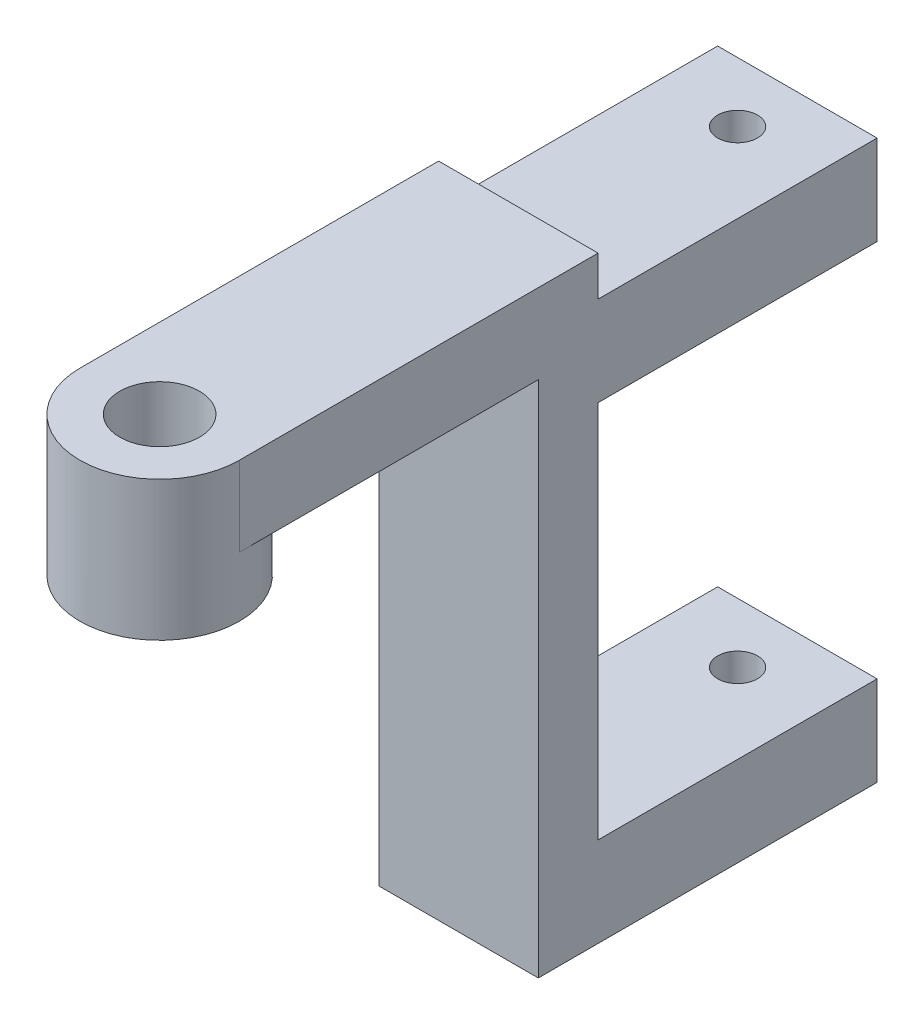
ISO-10303-21;
HEADER;
FILE_DESCRIPTION(('STEP AP214'),'2;1');
FILE_NAME('part.step','',(''),(''),'','','');
FILE_SCHEMA(('AUTOMOTIVE_DESIGN { 1 0 10303 214 1 1 1 1 }'));
ENDSEC;
DATA;
#1=APPLICATION_CONTEXT('core data for automotive mechanical design processes');
#2=APPLICATION_PROTOCOL_DEFINITION('international standard','automotive_design',2000,#1);
#3=PRODUCT_CONTEXT('',#1,'mechanical');
#4=PRODUCT('Part','Part','',(#3));
#5=PRODUCT_RELATED_PRODUCT_CATEGORY('part','',(#4));
#6=PRODUCT_DEFINITION_FORMATION('','',#4);
#7=PRODUCT_DEFINITION_CONTEXT('part definition',#1,'design');
#8=PRODUCT_DEFINITION('design','',#6,#7);
#9=PRODUCT_DEFINITION_SHAPE('','',#8);
#10=(LENGTH_UNIT() NAMED_UNIT(*) SI_UNIT(.MILLI.,.METRE.));
#11=(NAMED_UNIT(*) PLANE_ANGLE_UNIT() SI_UNIT($,.RADIAN.));
#12=(NAMED_UNIT(*) SI_UNIT($,.STERADIAN.) SOLID_ANGLE_UNIT());
#13=UNCERTAINTY_MEASURE_WITH_UNIT(LENGTH_MEASURE(1.E-05),#10,'distance_accuracy_value','');
#14=(GEOMETRIC_REPRESENTATION_CONTEXT(3) GLOBAL_UNCERTAINTY_ASSIGNED_CONTEXT((#13)) GLOBAL_UNIT_ASSIGNED_CONTEXT((#10,
#11,#12)) REPRESENTATION_CONTEXT('',''));
#15=CARTESIAN_POINT('',(0.,0.,0.));
#16=DIRECTION('',(0.,0.,1.));
#17=DIRECTION('',(1.,0.,0.));
#18=AXIS2_PLACEMENT_3D('',#15,#16,#17);
#19=CARTESIAN_POINT('',(0.,0.,-18.));
#20=DIRECTION('',(0.,0.,-1.));
#21=DIRECTION('',(-1.,0.,0.));
#22=AXIS2_PLACEMENT_3D('',#19,#20,#21);
#23=PLANE('',#22);
#24=DIRECTION('',(0.,-1.,0.));
#25=VECTOR('',#24,1.);
#26=CARTESIAN_POINT('',(4.,0.,-18.));
#27=LINE('',#26,#25);
#28=CARTESIAN_POINT('',(4.,7.,-18.));
#29=VERTEX_POINT('',#28);
#30=CARTESIAN_POINT('',(4.,4.99999999999999,-18.));
#31=VERTEX_POINT('',#30);
#32=EDGE_CURVE('E73',#29,#31,#27,.T.);
#33=ORIENTED_EDGE('',*,*,#32,.T.);
#34=DIRECTION('',(-1.,0.,0.));
#35=VECTOR('',#34,1.);
#36=CARTESIAN_POINT('',(0.,4.99999999999999,-18.));
#37=LINE('',#36,#35);
#38=CARTESIAN_POINT('',(-4.,4.99999999999999,-18.));
#39=VERTEX_POINT('',#38);
#40=EDGE_CURVE('E149',#31,#39,#37,.T.);
#41=ORIENTED_EDGE('',*,*,#40,.T.);
#42=DIRECTION('',(0.,-1.,0.));
#43=VECTOR('',#42,1.);
#44=CARTESIAN_POINT('',(-4.,0.,-18.));
#45=LINE('',#44,#43);
#46=CARTESIAN_POINT('',(-4.,7.,-18.));
#47=VERTEX_POINT('',#46);
#48=EDGE_CURVE('E199',#47,#39,#45,.T.);
#49=ORIENTED_EDGE('',*,*,#48,.F.);
#50=DIRECTION('',(1.,0.,0.));
#51=VECTOR('',#50,1.);
#52=CARTESIAN_POINT('',(0.,7.,-18.));
#53=LINE('',#52,#51);
#54=EDGE_CURVE('E202',#47,#29,#53,.T.);
#55=ORIENTED_EDGE('',*,*,#54,.T.);
#56=EDGE_LOOP('',(#33,#41,#49,#55));
#57=FACE_BOUND('',#56,.T.);
#58=ADVANCED_FACE('F49',(#57),#23,.T.);
#59=CARTESIAN_POINT('',(0.,0.,0.));
#60=DIRECTION('',(0.,1.,0.));
#61=DIRECTION('',(0.,0.,1.));
#62=AXIS2_PLACEMENT_3D('',#59,#60,#61);
#63=PLANE('',#62);
#64=CARTESIAN_POINT('',(0.,0.,0.));
#65=DIRECTION('',(0.,1.,0.));
#66=DIRECTION('',(1.,0.,0.));
#67=AXIS2_PLACEMENT_3D('',#64,#65,#66);
#68=CIRCLE('',#67,4.);
#69=CARTESIAN_POINT('',(4.,0.,0.));
#70=VERTEX_POINT('',#69);
#71=EDGE_CURVE('E58',#70,#70,#68,.T.);
#72=ORIENTED_EDGE('',*,*,#71,.F.);
#73=EDGE_LOOP('',(#72));
#74=FACE_BOUND('',#73,.T.);
#75=CARTESIAN_POINT('',(0.,0.,0.));
#76=DIRECTION('',(0.,1.,0.));
#77=DIRECTION('',(0.,0.,1.));
#78=AXIS2_PLACEMENT_3D('',#75,#76,#77);
#79=CIRCLE('',#78,2.);
#80=CARTESIAN_POINT('',(0.,0.,2.));
#81=VERTEX_POINT('',#80);
#82=EDGE_CURVE('E242',#81,#81,#79,.T.);
#83=ORIENTED_EDGE('',*,*,#82,.T.);
#84=EDGE_LOOP('',(#83));
#85=FACE_BOUND('',#84,.T.);
#86=ADVANCED_FACE('F249',(#74,#85),#63,.F.);
#87=CARTESIAN_POINT('',(0.,3.,0.));
#88=DIRECTION('',(0.,-1.,0.));
#89=DIRECTION('',(0.,0.,-1.));
#90=AXIS2_PLACEMENT_3D('',#87,#88,#89);
#91=CYLINDRICAL_SURFACE('',#90,4.);
#92=DIRECTION('',(0.,1.,0.));
#93=VECTOR('',#92,1.);
#94=CARTESIAN_POINT('',(4.,3.,0.));
#95=LINE('',#94,#93);
#96=CARTESIAN_POINT('',(4.,3.,0.));
#97=VERTEX_POINT('',#96);
#98=CARTESIAN_POINT('',(4.,7.,0.));
#99=VERTEX_POINT('',#98);
#100=EDGE_CURVE('E235',#97,#99,#95,.T.);
#101=ORIENTED_EDGE('',*,*,#100,.T.);
#102=CARTESIAN_POINT('',(0.,7.,0.));
#103=DIRECTION('',(0.,1.,0.));
#104=DIRECTION('',(0.,0.,1.));
#105=AXIS2_PLACEMENT_3D('',#102,#103,#104);
#106=CIRCLE('',#105,4.);
#107=CARTESIAN_POINT('',(-4.,7.,0.));
#108=VERTEX_POINT('',#107);
#109=EDGE_CURVE('E217',#108,#99,#106,.T.);
#110=ORIENTED_EDGE('',*,*,#109,.F.);
#111=DIRECTION('',(0.,1.,0.));
#112=VECTOR('',#111,1.);
#113=CARTESIAN_POINT('',(-4.,3.,0.));
#114=LINE('',#113,#112);
#115=CARTESIAN_POINT('',(-4.,3.,0.));
#116=VERTEX_POINT('',#115);
#117=EDGE_CURVE('E236',#116,#108,#114,.T.);
#118=ORIENTED_EDGE('',*,*,#117,.F.);
#119=CARTESIAN_POINT('',(0.,3.,0.));
#120=DIRECTION('',(0.,1.,0.));
#121=DIRECTION('',(0.,0.,1.));
#122=AXIS2_PLACEMENT_3D('',#119,#120,#121);
#123=CIRCLE('',#122,4.);
#124=EDGE_CURVE('E13',#97,#116,#123,.T.);
#125=ORIENTED_EDGE('',*,*,#124,.F.);
#126=EDGE_LOOP('',(#101,#110,#118,#125));
#127=FACE_BOUND('',#126,.T.);
#128=ORIENTED_EDGE('',*,*,#71,.T.);
#129=EDGE_LOOP('',(#128));
#130=FACE_BOUND('',#129,.T.);
#131=ADVANCED_FACE('F51',(#127,#130),#91,.T.);
#132=CARTESIAN_POINT('',(0.,3.,0.));
#133=DIRECTION('',(0.,-1.,0.));
#134=DIRECTION('',(0.,0.,-1.));
#135=AXIS2_PLACEMENT_3D('',#132,#133,#134);
#136=CYLINDRICAL_SURFACE('',#135,2.);
#137=CARTESIAN_POINT('',(0.,3.,0.));
#138=DIRECTION('',(0.,1.,0.));
#139=DIRECTION('',(0.,0.,1.));
#140=AXIS2_PLACEMENT_3D('',#137,#138,#139);
#141=CIRCLE('',#140,2.);
#142=CARTESIAN_POINT('',(0.,3.,2.));
#143=VERTEX_POINT('',#142);
#144=EDGE_CURVE('E238',#143,#143,#141,.T.);
#145=ORIENTED_EDGE('',*,*,#144,.T.);
#146=EDGE_LOOP('',(#145));
#147=FACE_BOUND('',#146,.T.);
#148=ORIENTED_EDGE('',*,*,#82,.F.);
#149=EDGE_LOOP('',(#148));
#150=FACE_BOUND('',#149,.T.);
#151=ADVANCED_FACE('F254',(#147,#150),#136,.F.);
#152=CARTESIAN_POINT('',(0.,3.,0.));
#153=DIRECTION('',(0.,1.,0.));
#154=DIRECTION('',(0.,0.,1.));
#155=AXIS2_PLACEMENT_3D('',#152,#153,#154);
#156=PLANE('',#155);
#157=CARTESIAN_POINT('',(0.,3.,0.));
#158=DIRECTION('',(0.,1.,0.));
#159=DIRECTION('',(0.,0.,1.));
#160=AXIS2_PLACEMENT_3D('',#157,#158,#159);
#161=CIRCLE('',#160,0.5);
#162=CARTESIAN_POINT('',(0.,3.,0.5));
#163=VERTEX_POINT('',#162);
#164=EDGE_CURVE('E332',#163,#163,#161,.F.);
#165=ORIENTED_EDGE('',*,*,#164,.F.);
#166=EDGE_LOOP('',(#165));
#167=FACE_BOUND('',#166,.T.);
#168=ORIENTED_EDGE('',*,*,#144,.F.);
#169=EDGE_LOOP('',(#168));
#170=FACE_BOUND('',#169,.T.);
#171=ADVANCED_FACE('F256',(#167,#170),#156,.F.);
#172=CARTESIAN_POINT('',(0.,3.,0.));
#173=DIRECTION('',(0.,1.,0.));
#174=DIRECTION('',(0.,0.,1.));
#175=AXIS2_PLACEMENT_3D('',#172,#173,#174);
#176=PLANE('',#175);
#177=DIRECTION('',(0.,0.,1.));
#178=VECTOR('',#177,1.);
#179=CARTESIAN_POINT('',(4.,3.,0.));
#180=LINE('',#179,#178);
#181=CARTESIAN_POINT('',(4.,3.,-15.));
#182=VERTEX_POINT('',#181);
#183=EDGE_CURVE('E226',#182,#97,#180,.T.);
#184=ORIENTED_EDGE('',*,*,#183,.T.);
#185=ORIENTED_EDGE('',*,*,#124,.T.);
#186=DIRECTION('',(0.,0.,1.));
#187=VECTOR('',#186,1.);
#188=CARTESIAN_POINT('',(-4.,3.,0.));
#189=LINE('',#188,#187);
#190=CARTESIAN_POINT('',(-4.,3.,-15.));
#191=VERTEX_POINT('',#190);
#192=EDGE_CURVE('E232',#191,#116,#189,.T.);
#193=ORIENTED_EDGE('',*,*,#192,.F.);
#194=DIRECTION('',(1.,0.,0.));
#195=VECTOR('',#194,1.);
#196=CARTESIAN_POINT('',(0.,3.,-15.));
#197=LINE('',#196,#195);
#198=EDGE_CURVE('E229',#191,#182,#197,.T.);
#199=ORIENTED_EDGE('',*,*,#198,.T.);
#200=EDGE_LOOP('',(#184,#185,#193,#199));
#201=FACE_BOUND('',#200,.T.);
#202=ADVANCED_FACE('F263',(#201),#176,.F.);
#203=CARTESIAN_POINT('',(-4.,3.,0.));
#204=DIRECTION('',(-1.,0.,0.));
#205=DIRECTION('',(0.,0.,1.));
#206=AXIS2_PLACEMENT_3D('',#203,#204,#205);
#207=PLANE('',#206);
#208=ORIENTED_EDGE('',*,*,#117,.T.);
#209=DIRECTION('',(0.,0.,1.));
#210=VECTOR('',#209,1.);
#211=CARTESIAN_POINT('',(-4.,7.,0.));
#212=LINE('',#211,#210);
#213=EDGE_CURVE('E223',#47,#108,#212,.T.);
#214=ORIENTED_EDGE('',*,*,#213,.F.);
#215=ORIENTED_EDGE('',*,*,#48,.T.);
#216=DIRECTION('',(0.,0.,1.));
#217=VECTOR('',#216,1.);
#218=CARTESIAN_POINT('',(-4.,4.99999999999999,-32.));
#219=LINE('',#218,#217);
#220=CARTESIAN_POINT('',(-4.,4.99999999999999,-32.));
#221=VERTEX_POINT('',#220);
#222=EDGE_CURVE('E185',#221,#39,#219,.T.);
#223=ORIENTED_EDGE('',*,*,#222,.F.);
#224=DIRECTION('',(0.,1.,0.));
#225=VECTOR('',#224,1.);
#226=CARTESIAN_POINT('',(-4.,0.,-32.));
#227=LINE('',#226,#225);
#228=CARTESIAN_POINT('',(-4.,0.5,-32.));
#229=VERTEX_POINT('',#228);
#230=EDGE_CURVE('E183',#229,#221,#227,.T.);
#231=ORIENTED_EDGE('',*,*,#230,.F.);
#232=DIRECTION('',(0.,0.,1.));
#233=VECTOR('',#232,1.);
#234=CARTESIAN_POINT('',(-4.,0.5,-32.));
#235=LINE('',#234,#233);
#236=CARTESIAN_POINT('',(-4.,0.5,-18.));
#237=VERTEX_POINT('',#236);
#238=EDGE_CURVE('E190',#229,#237,#235,.T.);
#239=ORIENTED_EDGE('',*,*,#238,.T.);
#240=CARTESIAN_POINT('',(-4.00000000000001,-18.5,-18.));
#241=VERTEX_POINT('',#240);
#242=EDGE_CURVE('E203',#237,#241,#45,.T.);
#243=ORIENTED_EDGE('',*,*,#242,.T.);
#244=DIRECTION('',(0.,0.,1.));
#245=VECTOR('',#244,1.);
#246=CARTESIAN_POINT('',(-4.00000000000001,-18.5,-32.));
#247=LINE('',#246,#245);
#248=CARTESIAN_POINT('',(-4.00000000000001,-18.5,-32.));
#249=VERTEX_POINT('',#248);
#250=EDGE_CURVE('E150',#249,#241,#247,.T.);
#251=ORIENTED_EDGE('',*,*,#250,.F.);
#252=DIRECTION('',(0.,1.,0.));
#253=VECTOR('',#252,1.);
#254=CARTESIAN_POINT('',(-4.,0.,-32.));
#255=LINE('',#254,#253);
#256=CARTESIAN_POINT('',(-4.00000000000001,-23.,-32.));
#257=VERTEX_POINT('',#256);
#258=EDGE_CURVE('E165',#257,#249,#255,.T.);
#259=ORIENTED_EDGE('',*,*,#258,.F.);
#260=DIRECTION('',(0.,0.,1.));
#261=VECTOR('',#260,1.);
#262=CARTESIAN_POINT('',(-4.00000000000001,-23.,-18.));
#263=LINE('',#262,#261);
#264=CARTESIAN_POINT('',(-4.00000000000001,-23.,-15.));
#265=VERTEX_POINT('',#264);
#266=EDGE_CURVE('E207',#257,#265,#263,.T.);
#267=ORIENTED_EDGE('',*,*,#266,.T.);
#268=DIRECTION('',(0.,-1.,0.));
#269=VECTOR('',#268,1.);
#270=CARTESIAN_POINT('',(-4.,0.,-15.));
#271=LINE('',#270,#269);
#272=EDGE_CURVE('E198',#191,#265,#271,.T.);
#273=ORIENTED_EDGE('',*,*,#272,.F.);
#274=ORIENTED_EDGE('',*,*,#192,.T.);
#275=EDGE_LOOP('',(#208,#214,#215,#223,#231,#239,#243,#251,#259,#267,#273,#274));
#276=FACE_BOUND('',#275,.T.);
#277=ADVANCED_FACE('F288',(#276),#207,.T.);
#278=CARTESIAN_POINT('',(4.,3.,0.));
#279=DIRECTION('',(-1.,0.,0.));
#280=DIRECTION('',(0.,0.,1.));
#281=AXIS2_PLACEMENT_3D('',#278,#279,#280);
#282=PLANE('',#281);
#283=ORIENTED_EDGE('',*,*,#183,.F.);
#284=DIRECTION('',(0.,-1.,0.));
#285=VECTOR('',#284,1.);
#286=CARTESIAN_POINT('',(4.,0.,-15.));
#287=LINE('',#286,#285);
#288=CARTESIAN_POINT('',(4.,-23.,-15.));
#289=VERTEX_POINT('',#288);
#290=EDGE_CURVE('E209',#182,#289,#287,.T.);
#291=ORIENTED_EDGE('',*,*,#290,.T.);
#292=DIRECTION('',(0.,0.,1.));
#293=VECTOR('',#292,1.);
#294=CARTESIAN_POINT('',(4.,-23.,-18.));
#295=LINE('',#294,#293);
#296=CARTESIAN_POINT('',(4.,-23.,-32.));
#297=VERTEX_POINT('',#296);
#298=EDGE_CURVE('E157',#297,#289,#295,.T.);
#299=ORIENTED_EDGE('',*,*,#298,.F.);
#300=DIRECTION('',(0.,-1.,0.));
#301=VECTOR('',#300,1.);
#302=CARTESIAN_POINT('',(4.,0.,-32.));
#303=LINE('',#302,#301);
#304=CARTESIAN_POINT('',(4.,-18.5,-32.));
#305=VERTEX_POINT('',#304);
#306=EDGE_CURVE('E153',#305,#297,#303,.T.);
#307=ORIENTED_EDGE('',*,*,#306,.F.);
#308=DIRECTION('',(0.,0.,1.));
#309=VECTOR('',#308,1.);
#310=CARTESIAN_POINT('',(4.,-18.5,-32.));
#311=LINE('',#310,#309);
#312=CARTESIAN_POINT('',(4.,-18.5,-18.));
#313=VERTEX_POINT('',#312);
#314=EDGE_CURVE('E141',#305,#313,#311,.T.);
#315=ORIENTED_EDGE('',*,*,#314,.T.);
#316=CARTESIAN_POINT('',(4.,0.5,-18.));
#317=VERTEX_POINT('',#316);
#318=EDGE_CURVE('E205',#317,#313,#27,.T.);
#319=ORIENTED_EDGE('',*,*,#318,.F.);
#320=DIRECTION('',(0.,0.,1.));
#321=VECTOR('',#320,1.);
#322=CARTESIAN_POINT('',(4.,0.5,-32.));
#323=LINE('',#322,#321);
#324=CARTESIAN_POINT('',(4.,0.5,-32.));
#325=VERTEX_POINT('',#324);
#326=EDGE_CURVE('E193',#325,#317,#323,.T.);
#327=ORIENTED_EDGE('',*,*,#326,.F.);
#328=DIRECTION('',(0.,-1.,0.));
#329=VECTOR('',#328,1.);
#330=CARTESIAN_POINT('',(4.,0.,-32.));
#331=LINE('',#330,#329);
#332=CARTESIAN_POINT('',(4.,4.99999999999999,-32.));
#333=VERTEX_POINT('',#332);
#334=EDGE_CURVE('E179',#333,#325,#331,.T.);
#335=ORIENTED_EDGE('',*,*,#334,.F.);
#336=DIRECTION('',(0.,0.,1.));
#337=VECTOR('',#336,1.);
#338=CARTESIAN_POINT('',(4.,4.99999999999999,-32.));
#339=LINE('',#338,#337);
#340=EDGE_CURVE('E196',#333,#31,#339,.T.);
#341=ORIENTED_EDGE('',*,*,#340,.T.);
#342=ORIENTED_EDGE('',*,*,#32,.F.);
#343=DIRECTION('',(0.,0.,1.));
#344=VECTOR('',#343,1.);
#345=CARTESIAN_POINT('',(4.,7.,0.));
#346=LINE('',#345,#344);
#347=EDGE_CURVE('E220',#29,#99,#346,.T.);
#348=ORIENTED_EDGE('',*,*,#347,.T.);
#349=ORIENTED_EDGE('',*,*,#100,.F.);
#350=EDGE_LOOP('',(#283,#291,#299,#307,#315,#319,#327,#335,#341,#342,#348,#349));
#351=FACE_BOUND('',#350,.T.);
#352=ADVANCED_FACE('F155',(#351),#282,.F.);
#353=CARTESIAN_POINT('',(0.,7.,0.));
#354=DIRECTION('',(0.,1.,0.));
#355=DIRECTION('',(0.,0.,1.));
#356=AXIS2_PLACEMENT_3D('',#353,#354,#355);
#357=PLANE('',#356);
#358=CARTESIAN_POINT('',(0.,7.,0.));
#359=DIRECTION('',(0.,1.,0.));
#360=DIRECTION('',(0.,0.,1.));
#361=AXIS2_PLACEMENT_3D('',#358,#359,#360);
#362=CIRCLE('',#361,2.);
#363=CARTESIAN_POINT('',(0.,7.,2.));
#364=VERTEX_POINT('',#363);
#365=EDGE_CURVE('E329',#364,#364,#362,.T.);
#366=ORIENTED_EDGE('',*,*,#365,.F.);
#367=EDGE_LOOP('',(#366));
#368=FACE_BOUND('',#367,.T.);
#369=ORIENTED_EDGE('',*,*,#109,.T.);
#370=ORIENTED_EDGE('',*,*,#347,.F.);
#371=ORIENTED_EDGE('',*,*,#54,.F.);
#372=ORIENTED_EDGE('',*,*,#213,.T.);
#373=EDGE_LOOP('',(#369,#370,#371,#372));
#374=FACE_BOUND('',#373,.T.);
#375=ADVANCED_FACE('F283',(#368,#374),#357,.T.);
#376=CARTESIAN_POINT('',(0.,-23.,-18.));
#377=DIRECTION('',(0.,1.,0.));
#378=DIRECTION('',(0.,0.,1.));
#379=AXIS2_PLACEMENT_3D('',#376,#377,#378);
#380=PLANE('',#379);
#381=CARTESIAN_POINT('',(0.,-23.,-29.));
#382=DIRECTION('',(0.,1.,0.));
#383=DIRECTION('',(0.,0.,1.));
#384=AXIS2_PLACEMENT_3D('',#381,#382,#383);
#385=CIRCLE('',#384,1.);
#386=CARTESIAN_POINT('',(0.,-23.,-28.));
#387=VERTEX_POINT('',#386);
#388=EDGE_CURVE('E168',#387,#387,#385,.F.);
#389=ORIENTED_EDGE('',*,*,#388,.F.);
#390=EDGE_LOOP('',(#389));
#391=FACE_BOUND('',#390,.T.);
#392=DIRECTION('',(-1.,0.,0.));
#393=VECTOR('',#392,1.);
#394=CARTESIAN_POINT('',(0.,-23.,-15.));
#395=LINE('',#394,#393);
#396=EDGE_CURVE('E211',#289,#265,#395,.T.);
#397=ORIENTED_EDGE('',*,*,#396,.T.);
#398=ORIENTED_EDGE('',*,*,#266,.F.);
#399=DIRECTION('',(-1.,0.,0.));
#400=VECTOR('',#399,1.);
#401=CARTESIAN_POINT('',(0.,-23.,-32.));
#402=LINE('',#401,#400);
#403=EDGE_CURVE('E161',#297,#257,#402,.T.);
#404=ORIENTED_EDGE('',*,*,#403,.F.);
#405=ORIENTED_EDGE('',*,*,#298,.T.);
#406=EDGE_LOOP('',(#397,#398,#404,#405));
#407=FACE_BOUND('',#406,.T.);
#408=ADVANCED_FACE('F276',(#391,#407),#380,.F.);
#409=DIRECTION('',(-1.,0.,0.));
#410=VECTOR('',#409,1.);
#411=CARTESIAN_POINT('',(0.,-18.5,-18.));
#412=LINE('',#411,#410);
#413=EDGE_CURVE('E147',#313,#241,#412,.T.);
#414=ORIENTED_EDGE('',*,*,#413,.T.);
#415=ORIENTED_EDGE('',*,*,#242,.F.);
#416=DIRECTION('',(-1.,0.,0.));
#417=VECTOR('',#416,1.);
#418=CARTESIAN_POINT('',(0.,0.5,-18.));
#419=LINE('',#418,#417);
#420=EDGE_CURVE('E65',#317,#237,#419,.T.);
#421=ORIENTED_EDGE('',*,*,#420,.F.);
#422=ORIENTED_EDGE('',*,*,#318,.T.);
#423=EDGE_LOOP('',(#414,#415,#421,#422));
#424=FACE_BOUND('',#423,.T.);
#425=ADVANCED_FACE('F269',(#424),#23,.T.);
#426=CARTESIAN_POINT('',(0.,0.,-15.));
#427=DIRECTION('',(0.,0.,-1.));
#428=DIRECTION('',(-1.,0.,0.));
#429=AXIS2_PLACEMENT_3D('',#426,#427,#428);
#430=PLANE('',#429);
#431=ORIENTED_EDGE('',*,*,#198,.F.);
#432=ORIENTED_EDGE('',*,*,#272,.T.);
#433=ORIENTED_EDGE('',*,*,#396,.F.);
#434=ORIENTED_EDGE('',*,*,#290,.F.);
#435=EDGE_LOOP('',(#431,#432,#433,#434));
#436=FACE_BOUND('',#435,.T.);
#437=ADVANCED_FACE('F275',(#436),#430,.F.);
#438=CARTESIAN_POINT('',(0.,4.99999999999999,-32.));
#439=DIRECTION('',(0.,1.,0.));
#440=DIRECTION('',(-1.,0.,0.));
#441=AXIS2_PLACEMENT_3D('',#438,#439,#440);
#442=PLANE('',#441);
#443=CARTESIAN_POINT('',(0.,4.99999999999999,-29.));
#444=DIRECTION('',(0.,1.,0.));
#445=DIRECTION('',(-1.,0.,0.));
#446=AXIS2_PLACEMENT_3D('',#443,#444,#445);
#447=CIRCLE('',#446,1.);
#448=CARTESIAN_POINT('',(0.,4.99999999999999,-28.));
#449=VERTEX_POINT('',#448);
#450=EDGE_CURVE('E343',#449,#449,#447,.F.);
#451=ORIENTED_EDGE('',*,*,#450,.T.);
#452=EDGE_LOOP('',(#451));
#453=FACE_BOUND('',#452,.T.);
#454=ORIENTED_EDGE('',*,*,#40,.F.);
#455=ORIENTED_EDGE('',*,*,#340,.F.);
#456=DIRECTION('',(-1.,0.,0.));
#457=VECTOR('',#456,1.);
#458=CARTESIAN_POINT('',(0.,4.99999999999999,-32.));
#459=LINE('',#458,#457);
#460=EDGE_CURVE('E176',#333,#221,#459,.T.);
#461=ORIENTED_EDGE('',*,*,#460,.T.);
#462=ORIENTED_EDGE('',*,*,#222,.T.);
#463=EDGE_LOOP('',(#454,#455,#461,#462));
#464=FACE_BOUND('',#463,.T.);
#465=ADVANCED_FACE('F281',(#453,#464),#442,.T.);
#466=CARTESIAN_POINT('',(0.,0.5,-32.));
#467=DIRECTION('',(0.,1.,0.));
#468=DIRECTION('',(0.,0.,1.));
#469=AXIS2_PLACEMENT_3D('',#466,#467,#468);
#470=PLANE('',#469);
#471=CARTESIAN_POINT('',(0.,0.5,-29.));
#472=DIRECTION('',(0.,1.,0.));
#473=DIRECTION('',(0.,0.,1.));
#474=AXIS2_PLACEMENT_3D('',#471,#472,#473);
#475=CIRCLE('',#474,1.);
#476=CARTESIAN_POINT('',(0.,0.499999999999997,-28.));
#477=VERTEX_POINT('',#476);
#478=EDGE_CURVE('E341',#477,#477,#475,.F.);
#479=ORIENTED_EDGE('',*,*,#478,.F.);
#480=EDGE_LOOP('',(#479));
#481=FACE_BOUND('',#480,.T.);
#482=ORIENTED_EDGE('',*,*,#420,.T.);
#483=ORIENTED_EDGE('',*,*,#238,.F.);
#484=DIRECTION('',(-1.,0.,0.));
#485=VECTOR('',#484,1.);
#486=CARTESIAN_POINT('',(0.,0.5,-32.));
#487=LINE('',#486,#485);
#488=EDGE_CURVE('E181',#325,#229,#487,.T.);
#489=ORIENTED_EDGE('',*,*,#488,.F.);
#490=ORIENTED_EDGE('',*,*,#326,.T.);
#491=EDGE_LOOP('',(#482,#483,#489,#490));
#492=FACE_BOUND('',#491,.T.);
#493=ADVANCED_FACE('F294',(#481,#492),#470,.F.);
#494=CARTESIAN_POINT('',(0.,0.,-32.));
#495=DIRECTION('',(0.,0.,-1.));
#496=DIRECTION('',(-1.,0.,0.));
#497=AXIS2_PLACEMENT_3D('',#494,#495,#496);
#498=PLANE('',#497);
#499=ORIENTED_EDGE('',*,*,#460,.F.);
#500=ORIENTED_EDGE('',*,*,#334,.T.);
#501=ORIENTED_EDGE('',*,*,#488,.T.);
#502=ORIENTED_EDGE('',*,*,#230,.T.);
#503=EDGE_LOOP('',(#499,#500,#501,#502));
#504=FACE_BOUND('',#503,.T.);
#505=ADVANCED_FACE('F300',(#504),#498,.T.);
#506=CARTESIAN_POINT('',(0.,-18.5,-32.));
#507=DIRECTION('',(0.,1.,0.));
#508=DIRECTION('',(0.,0.,1.));
#509=AXIS2_PLACEMENT_3D('',#506,#507,#508);
#510=PLANE('',#509);
#511=CARTESIAN_POINT('',(0.,-18.5,-29.));
#512=DIRECTION('',(0.,1.,0.));
#513=DIRECTION('',(0.,0.,1.));
#514=AXIS2_PLACEMENT_3D('',#511,#512,#513);
#515=CIRCLE('',#514,1.);
#516=CARTESIAN_POINT('',(0.,-18.5,-28.));
#517=VERTEX_POINT('',#516);
#518=EDGE_CURVE('E53',#517,#517,#515,.F.);
#519=ORIENTED_EDGE('',*,*,#518,.T.);
#520=EDGE_LOOP('',(#519));
#521=FACE_BOUND('',#520,.T.);
#522=ORIENTED_EDGE('',*,*,#413,.F.);
#523=ORIENTED_EDGE('',*,*,#314,.F.);
#524=DIRECTION('',(-1.,0.,0.));
#525=VECTOR('',#524,1.);
#526=CARTESIAN_POINT('',(0.,-18.5,-32.));
#527=LINE('',#526,#525);
#528=EDGE_CURVE('E145',#305,#249,#527,.T.);
#529=ORIENTED_EDGE('',*,*,#528,.T.);
#530=ORIENTED_EDGE('',*,*,#250,.T.);
#531=EDGE_LOOP('',(#522,#523,#529,#530));
#532=FACE_BOUND('',#531,.T.);
#533=ADVANCED_FACE('F143',(#521,#532),#510,.T.);
#534=CARTESIAN_POINT('',(0.,0.,-32.));
#535=DIRECTION('',(0.,0.,-1.));
#536=DIRECTION('',(-1.,0.,0.));
#537=AXIS2_PLACEMENT_3D('',#534,#535,#536);
#538=PLANE('',#537);
#539=ORIENTED_EDGE('',*,*,#528,.F.);
#540=ORIENTED_EDGE('',*,*,#306,.T.);
#541=ORIENTED_EDGE('',*,*,#403,.T.);
#542=ORIENTED_EDGE('',*,*,#258,.T.);
#543=EDGE_LOOP('',(#539,#540,#541,#542));
#544=FACE_BOUND('',#543,.T.);
#545=ADVANCED_FACE('F163',(#544),#538,.T.);
#546=CARTESIAN_POINT('',(0.,-25.5,-29.));
#547=DIRECTION('',(0.,1.,0.));
#548=DIRECTION('',(0.,0.,1.));
#549=AXIS2_PLACEMENT_3D('',#546,#547,#548);
#550=CYLINDRICAL_SURFACE('',#549,1.);
#551=CARTESIAN_POINT('',(0.,-18.5,-28.));
#552=CARTESIAN_POINT('',(0.,-18.546875,-28.));
#553=CARTESIAN_POINT('',(0.,-18.59375,-28.));
#554=CARTESIAN_POINT('',(0.,-18.6875,-28.));
#555=CARTESIAN_POINT('',(0.,-18.734375,-28.));
#556=CARTESIAN_POINT('',(0.,-18.828125,-28.));
#557=CARTESIAN_POINT('',(0.,-18.875,-28.));
#558=CARTESIAN_POINT('',(0.,-18.96875,-28.));
#559=CARTESIAN_POINT('',(0.,-19.015625,-28.));
#560=CARTESIAN_POINT('',(0.,-19.109375,-28.));
#561=CARTESIAN_POINT('',(0.,-19.15625,-28.));
#562=CARTESIAN_POINT('',(0.,-19.25,-28.));
#563=CARTESIAN_POINT('',(0.,-19.296875,-28.));
#564=CARTESIAN_POINT('',(0.,-19.390625,-28.));
#565=CARTESIAN_POINT('',(0.,-19.4375,-28.));
#566=CARTESIAN_POINT('',(0.,-19.53125,-28.));
#567=CARTESIAN_POINT('',(0.,-19.578125,-28.));
#568=CARTESIAN_POINT('',(0.,-19.671875,-28.));
#569=CARTESIAN_POINT('',(0.,-19.71875,-28.));
#570=CARTESIAN_POINT('',(0.,-19.8125,-28.));
#571=CARTESIAN_POINT('',(0.,-19.859375,-28.));
#572=CARTESIAN_POINT('',(0.,-19.953125,-28.));
#573=CARTESIAN_POINT('',(0.,-20.,-28.));
#574=CARTESIAN_POINT('',(0.,-20.09375,-28.));
#575=CARTESIAN_POINT('',(0.,-20.140625,-28.));
#576=CARTESIAN_POINT('',(0.,-20.234375,-28.));
#577=CARTESIAN_POINT('',(0.,-20.28125,-28.));
#578=CARTESIAN_POINT('',(0.,-20.375,-28.));
#579=CARTESIAN_POINT('',(0.,-20.421875,-28.));
#580=CARTESIAN_POINT('',(0.,-20.515625,-28.));
#581=CARTESIAN_POINT('',(0.,-20.5625,-28.));
#582=CARTESIAN_POINT('',(0.,-20.65625,-28.));
#583=CARTESIAN_POINT('',(0.,-20.703125,-28.));
#584=CARTESIAN_POINT('',(0.,-20.796875,-28.));
#585=CARTESIAN_POINT('',(0.,-20.84375,-28.));
#586=CARTESIAN_POINT('',(0.,-20.9375,-28.));
#587=CARTESIAN_POINT('',(0.,-20.984375,-28.));
#588=CARTESIAN_POINT('',(0.,-21.078125,-28.));
#589=CARTESIAN_POINT('',(0.,-21.125,-28.));
#590=CARTESIAN_POINT('',(0.,-21.21875,-28.));
#591=CARTESIAN_POINT('',(0.,-21.265625,-28.));
#592=CARTESIAN_POINT('',(0.,-21.359375,-28.));
#593=CARTESIAN_POINT('',(0.,-21.40625,-28.));
#594=CARTESIAN_POINT('',(0.,-21.5,-28.));
#595=CARTESIAN_POINT('',(0.,-21.546875,-28.));
#596=CARTESIAN_POINT('',(0.,-21.640625,-28.));
#597=CARTESIAN_POINT('',(0.,-21.6875,-28.));
#598=CARTESIAN_POINT('',(0.,-21.78125,-28.));
#599=CARTESIAN_POINT('',(0.,-21.828125,-28.));
#600=CARTESIAN_POINT('',(0.,-21.921875,-28.));
#601=CARTESIAN_POINT('',(0.,-21.96875,-28.));
#602=CARTESIAN_POINT('',(0.,-22.0625,-28.));
#603=CARTESIAN_POINT('',(0.,-22.109375,-28.));
#604=CARTESIAN_POINT('',(0.,-22.203125,-28.));
#605=CARTESIAN_POINT('',(0.,-22.25,-28.));
#606=CARTESIAN_POINT('',(0.,-22.34375,-28.));
#607=CARTESIAN_POINT('',(0.,-22.390625,-28.));
#608=CARTESIAN_POINT('',(0.,-22.484375,-28.));
#609=CARTESIAN_POINT('',(0.,-22.53125,-28.));
#610=CARTESIAN_POINT('',(0.,-22.625,-28.));
#611=CARTESIAN_POINT('',(0.,-22.671875,-28.));
#612=CARTESIAN_POINT('',(0.,-22.765625,-28.));
#613=CARTESIAN_POINT('',(0.,-22.8125,-28.));
#614=CARTESIAN_POINT('',(0.,-22.90625,-28.));
#615=CARTESIAN_POINT('',(0.,-22.953125,-28.));
#616=CARTESIAN_POINT('',(0.,-23.,-28.));
#617=B_SPLINE_CURVE_WITH_KNOTS('',3,(#551,#552,#553,#554,#555,#556,#557,#558,#559,#560,#561,
#562,#563,#564,#565,#566,#567,#568,#569,#570,#571,#572,#573,#574,#575,#576,#577,#578,#579,#580,
#581,#582,#583,#584,#585,#586,#587,#588,#589,#590,#591,#592,#593,#594,#595,#596,#597,#598,#599,
#600,#601,#602,#603,#604,#605,#606,#607,#608,#609,#610,#611,#612,#613,#614,#615,#616),
.UNSPECIFIED.,.F.,.F.,(4,2,2,2,2,2,2,2,2,2,2,2,2,2,2,2,2,2,2,2,2,2,2,2,2,2,2,2,2,2,2,2,4),(0.,
0.140625000000002,0.28125,0.421875000000002,0.5625,0.703125000000002,0.843750000000001,
0.984375000000003,1.125,1.265625,1.40625,1.546875,1.6875,1.828125,1.96875,2.109375,2.25,
2.390625,2.53125,2.671875,2.8125,2.953125,3.09375,3.234375,3.375,3.515625,3.65625,3.796875,
3.9375,4.078125,4.21875,4.359375,4.5),.UNSPECIFIED.);
#618=EDGE_CURVE('BSEAM350',#517,#387,#617,.T.);
#619=ORIENTED_EDGE('',*,*,#518,.F.);
#620=ORIENTED_EDGE('',*,*,#388,.T.);
#621=ORIENTED_EDGE('',*,*,#618,.T.);
#622=ORIENTED_EDGE('',*,*,#618,.F.);
#623=EDGE_LOOP('',(#619,#621,#620,#622));
#624=FACE_BOUND('',#623,.T.);
#625=ADVANCED_FACE('F350',(#624),#550,.F.);
#626=CARTESIAN_POINT('',(0.,4.99999999999999,-28.));
#627=CARTESIAN_POINT('',(0.,4.95312499999999,-28.));
#628=CARTESIAN_POINT('',(0.,4.90624999999999,-28.));
#629=CARTESIAN_POINT('',(0.,4.81249999999999,-28.));
#630=CARTESIAN_POINT('',(0.,4.76562499999999,-28.));
#631=CARTESIAN_POINT('',(0.,4.67187499999999,-28.));
#632=CARTESIAN_POINT('',(0.,4.62499999999999,-28.));
#633=CARTESIAN_POINT('',(0.,4.53124999999999,-28.));
#634=CARTESIAN_POINT('',(0.,4.48437499999999,-28.));
#635=CARTESIAN_POINT('',(0.,4.39062499999999,-28.));
#636=CARTESIAN_POINT('',(0.,4.34374999999999,-28.));
#637=CARTESIAN_POINT('',(0.,4.24999999999999,-28.));
#638=CARTESIAN_POINT('',(0.,4.20312499999999,-28.));
#639=CARTESIAN_POINT('',(0.,4.10937499999999,-28.));
#640=CARTESIAN_POINT('',(0.,4.06249999999999,-28.));
#641=CARTESIAN_POINT('',(0.,3.96874999999999,-28.));
#642=CARTESIAN_POINT('',(0.,3.92187499999999,-28.));
#643=CARTESIAN_POINT('',(0.,3.82812499999999,-28.));
#644=CARTESIAN_POINT('',(0.,3.78124999999999,-28.));
#645=CARTESIAN_POINT('',(0.,3.6875,-28.));
#646=CARTESIAN_POINT('',(0.,3.640625,-28.));
#647=CARTESIAN_POINT('',(0.,3.546875,-28.));
#648=CARTESIAN_POINT('',(0.,3.49999999999999,-28.));
#649=CARTESIAN_POINT('',(0.,3.40624999999999,-28.));
#650=CARTESIAN_POINT('',(0.,3.359375,-28.));
#651=CARTESIAN_POINT('',(0.,3.265625,-28.));
#652=CARTESIAN_POINT('',(0.,3.21874999999999,-28.));
#653=CARTESIAN_POINT('',(0.,3.12499999999999,-28.));
#654=CARTESIAN_POINT('',(0.,3.078125,-28.));
#655=CARTESIAN_POINT('',(0.,2.984375,-28.));
#656=CARTESIAN_POINT('',(0.,2.9375,-28.));
#657=CARTESIAN_POINT('',(0.,2.84375,-28.));
#658=CARTESIAN_POINT('',(0.,2.796875,-28.));
#659=CARTESIAN_POINT('',(0.,2.703125,-28.));
#660=CARTESIAN_POINT('',(0.,2.65624999999999,-28.));
#661=CARTESIAN_POINT('',(0.,2.56249999999999,-28.));
#662=CARTESIAN_POINT('',(0.,2.51562499999999,-28.));
#663=CARTESIAN_POINT('',(0.,2.421875,-28.));
#664=CARTESIAN_POINT('',(0.,2.375,-28.));
#665=CARTESIAN_POINT('',(0.,2.28125,-28.));
#666=CARTESIAN_POINT('',(0.,2.234375,-28.));
#667=CARTESIAN_POINT('',(0.,2.140625,-28.));
#668=CARTESIAN_POINT('',(0.,2.09375,-28.));
#669=CARTESIAN_POINT('',(0.,2.,-28.));
#670=CARTESIAN_POINT('',(0.,1.953125,-28.));
#671=CARTESIAN_POINT('',(0.,1.859375,-28.));
#672=CARTESIAN_POINT('',(0.,1.8125,-28.));
#673=CARTESIAN_POINT('',(0.,1.71875,-28.));
#674=CARTESIAN_POINT('',(0.,1.671875,-28.));
#675=CARTESIAN_POINT('',(0.,1.578125,-28.));
#676=CARTESIAN_POINT('',(0.,1.53125,-28.));
#677=CARTESIAN_POINT('',(0.,1.4375,-28.));
#678=CARTESIAN_POINT('',(0.,1.390625,-28.));
#679=CARTESIAN_POINT('',(0.,1.296875,-28.));
#680=CARTESIAN_POINT('',(0.,1.25,-28.));
#681=CARTESIAN_POINT('',(0.,1.15625,-28.));
#682=CARTESIAN_POINT('',(0.,1.109375,-28.));
#683=CARTESIAN_POINT('',(0.,1.015625,-28.));
#684=CARTESIAN_POINT('',(0.,0.968749999999996,-28.));
#685=CARTESIAN_POINT('',(0.,0.874999999999996,-28.));
#686=CARTESIAN_POINT('',(0.,0.828124999999997,-28.));
#687=CARTESIAN_POINT('',(0.,0.734374999999997,-28.));
#688=CARTESIAN_POINT('',(0.,0.687499999999996,-28.));
#689=CARTESIAN_POINT('',(0.,0.593749999999996,-28.));
#690=CARTESIAN_POINT('',(0.,0.546874999999996,-28.));
#691=CARTESIAN_POINT('',(0.,0.499999999999997,-28.));
#692=B_SPLINE_CURVE_WITH_KNOTS('',3,(#626,#627,#628,#629,#630,#631,#632,#633,#634,#635,#636,
#637,#638,#639,#640,#641,#642,#643,#644,#645,#646,#647,#648,#649,#650,#651,#652,#653,#654,#655,
#656,#657,#658,#659,#660,#661,#662,#663,#664,#665,#666,#667,#668,#669,#670,#671,#672,#673,#674,
#675,#676,#677,#678,#679,#680,#681,#682,#683,#684,#685,#686,#687,#688,#689,#690,#691),
.UNSPECIFIED.,.F.,.F.,(4,2,2,2,2,2,2,2,2,2,2,2,2,2,2,2,2,2,2,2,2,2,2,2,2,2,2,2,2,2,2,2,4),(0.,
0.140624999999998,0.28125,0.421874999999999,0.5625,0.703124999999999,0.843750000000001,
0.984374999999999,1.125,1.265625,1.40625,1.546875,1.6875,1.828125,1.96875,2.109375,2.25,
2.390625,2.53125,2.671875,2.8125,2.953125,3.09375,3.234375,3.375,3.515625,3.65625,3.796875,
3.9375,4.078125,4.21875,4.359375,4.5),.UNSPECIFIED.);
#693=EDGE_CURVE('BSEAM352',#449,#477,#692,.T.);
#694=ORIENTED_EDGE('',*,*,#450,.F.);
#695=ORIENTED_EDGE('',*,*,#478,.T.);
#696=ORIENTED_EDGE('',*,*,#693,.T.);
#697=ORIENTED_EDGE('',*,*,#693,.F.);
#698=EDGE_LOOP('',(#694,#696,#695,#697));
#699=FACE_BOUND('',#698,.T.);
#700=ADVANCED_FACE('F352',(#699),#550,.F.);
#701=CARTESIAN_POINT('',(0.,-2.65685424949238,0.));
#702=DIRECTION('',(0.,1.,0.));
#703=DIRECTION('',(0.,0.,1.));
#704=AXIS2_PLACEMENT_3D('',#701,#702,#703);
#705=CYLINDRICAL_SURFACE('',#704,2.);
#706=CARTESIAN_POINT('',(0.,4.,0.));
#707=DIRECTION('',(0.,1.,0.));
#708=DIRECTION('',(0.,0.,1.));
#709=AXIS2_PLACEMENT_3D('',#706,#707,#708);
#710=CIRCLE('',#709,2.);
#711=CARTESIAN_POINT('',(0.,4.,2.));
#712=VERTEX_POINT('',#711);
#713=EDGE_CURVE('E331',#712,#712,#710,.F.);
#714=CARTESIAN_POINT('',(0.,4.,2.));
#715=CARTESIAN_POINT('',(0.,4.03125,2.));
#716=CARTESIAN_POINT('',(0.,4.0625,2.));
#717=CARTESIAN_POINT('',(0.,4.125,2.));
#718=CARTESIAN_POINT('',(0.,4.15625,2.));
#719=CARTESIAN_POINT('',(0.,4.21875,2.));
#720=CARTESIAN_POINT('',(0.,4.25,2.));
#721=CARTESIAN_POINT('',(0.,4.3125,2.));
#722=CARTESIAN_POINT('',(0.,4.34375,2.));
#723=CARTESIAN_POINT('',(0.,4.40625,2.));
#724=CARTESIAN_POINT('',(0.,4.4375,2.));
#725=CARTESIAN_POINT('',(0.,4.5,2.));
#726=CARTESIAN_POINT('',(0.,4.53125,2.));
#727=CARTESIAN_POINT('',(0.,4.59375,2.));
#728=CARTESIAN_POINT('',(0.,4.625,2.));
#729=CARTESIAN_POINT('',(0.,4.6875,2.));
#730=CARTESIAN_POINT('',(0.,4.71875,2.));
#731=CARTESIAN_POINT('',(0.,4.78125,2.));
#732=CARTESIAN_POINT('',(0.,4.8125,2.));
#733=CARTESIAN_POINT('',(0.,4.875,2.));
#734=CARTESIAN_POINT('',(0.,4.90625,2.));
#735=CARTESIAN_POINT('',(0.,4.96875,2.));
#736=CARTESIAN_POINT('',(0.,5.,2.));
#737=CARTESIAN_POINT('',(0.,5.0625,2.));
#738=CARTESIAN_POINT('',(0.,5.09375,2.));
#739=CARTESIAN_POINT('',(0.,5.15625,2.));
#740=CARTESIAN_POINT('',(0.,5.1875,2.));
#741=CARTESIAN_POINT('',(0.,5.25,2.));
#742=CARTESIAN_POINT('',(0.,5.28125,2.));
#743=CARTESIAN_POINT('',(0.,5.34375,2.));
#744=CARTESIAN_POINT('',(0.,5.375,2.));
#745=CARTESIAN_POINT('',(0.,5.4375,2.));
#746=CARTESIAN_POINT('',(0.,5.46875,2.));
#747=CARTESIAN_POINT('',(0.,5.53125,2.));
#748=CARTESIAN_POINT('',(0.,5.5625,2.));
#749=CARTESIAN_POINT('',(0.,5.625,2.));
#750=CARTESIAN_POINT('',(0.,5.65625,2.));
#751=CARTESIAN_POINT('',(0.,5.71875,2.));
#752=CARTESIAN_POINT('',(0.,5.75,2.));
#753=CARTESIAN_POINT('',(0.,5.8125,2.));
#754=CARTESIAN_POINT('',(0.,5.84375,2.));
#755=CARTESIAN_POINT('',(0.,5.90625,2.));
#756=CARTESIAN_POINT('',(0.,5.9375,2.));
#757=CARTESIAN_POINT('',(0.,6.,2.));
#758=CARTESIAN_POINT('',(0.,6.03125,2.));
#759=CARTESIAN_POINT('',(0.,6.09375,2.));
#760=CARTESIAN_POINT('',(0.,6.125,2.));
#761=CARTESIAN_POINT('',(0.,6.1875,2.));
#762=CARTESIAN_POINT('',(0.,6.21875,2.));
#763=CARTESIAN_POINT('',(0.,6.28125,2.));
#764=CARTESIAN_POINT('',(0.,6.3125,2.));
#765=CARTESIAN_POINT('',(0.,6.375,2.));
#766=CARTESIAN_POINT('',(0.,6.40625,2.));
#767=CARTESIAN_POINT('',(0.,6.46875,2.));
#768=CARTESIAN_POINT('',(0.,6.5,2.));
#769=CARTESIAN_POINT('',(0.,6.5625,2.));
#770=CARTESIAN_POINT('',(0.,6.59375,2.));
#771=CARTESIAN_POINT('',(0.,6.65625,2.));
#772=CARTESIAN_POINT('',(0.,6.6875,2.));
#773=CARTESIAN_POINT('',(0.,6.75,2.));
#774=CARTESIAN_POINT('',(0.,6.78125,2.));
#775=CARTESIAN_POINT('',(0.,6.84375,2.));
#776=CARTESIAN_POINT('',(0.,6.875,2.));
#777=CARTESIAN_POINT('',(0.,6.9375,2.));
#778=CARTESIAN_POINT('',(0.,6.96875,2.));
#779=CARTESIAN_POINT('',(0.,7.,2.));
#780=B_SPLINE_CURVE_WITH_KNOTS('',3,(#714,#715,#716,#717,#718,#719,#720,#721,#722,#723,#724,
#725,#726,#727,#728,#729,#730,#731,#732,#733,#734,#735,#736,#737,#738,#739,#740,#741,#742,#743,
#744,#745,#746,#747,#748,#749,#750,#751,#752,#753,#754,#755,#756,#757,#758,#759,#760,#761,#762,
#763,#764,#765,#766,#767,#768,#769,#770,#771,#772,#773,#774,#775,#776,#777,#778,#779),
.UNSPECIFIED.,.F.,.F.,(4,2,2,2,2,2,2,2,2,2,2,2,2,2,2,2,2,2,2,2,2,2,2,2,2,2,2,2,2,2,2,2,4),(0.,
0.0937500000000001,0.1875,0.28125,0.375,0.46875,0.5625,0.65625,0.75,0.84375,0.9375,1.03125,
1.125,1.21875,1.3125,1.40625,1.5,1.59375,1.6875,1.78125,1.875,1.96875,2.0625,2.15625,2.25,
2.34375,2.4375,2.53125,2.625,2.71875,2.8125,2.90625,3.),.UNSPECIFIED.);
#781=EDGE_CURVE('BSEAM359',#712,#364,#780,.T.);
#782=ORIENTED_EDGE('',*,*,#713,.T.);
#783=ORIENTED_EDGE('',*,*,#365,.T.);
#784=ORIENTED_EDGE('',*,*,#781,.T.);
#785=ORIENTED_EDGE('',*,*,#781,.F.);
#786=EDGE_LOOP('',(#782,#784,#783,#785));
#787=FACE_BOUND('',#786,.T.);
#788=ADVANCED_FACE('F359',(#787),#705,.F.);
#789=CARTESIAN_POINT('',(0.,4.,0.));
#790=DIRECTION('',(0.,1.,0.));
#791=DIRECTION('',(0.,0.,1.));
#792=AXIS2_PLACEMENT_3D('',#789,#790,#791);
#793=PLANE('',#792);
#794=CARTESIAN_POINT('',(0.,4.,0.));
#795=DIRECTION('',(0.,1.,0.));
#796=DIRECTION('',(0.,0.,1.));
#797=AXIS2_PLACEMENT_3D('',#794,#795,#796);
#798=CIRCLE('',#797,0.5);
#799=CARTESIAN_POINT('',(0.,4.,0.5));
#800=VERTEX_POINT('',#799);
#801=EDGE_CURVE('E337',#800,#800,#798,.T.);
#802=ORIENTED_EDGE('',*,*,#801,.F.);
#803=EDGE_LOOP('',(#802));
#804=FACE_BOUND('',#803,.T.);
#805=ORIENTED_EDGE('',*,*,#713,.F.);
#806=EDGE_LOOP('',(#805));
#807=FACE_BOUND('',#806,.T.);
#808=ADVANCED_FACE('F449',(#804,#807),#793,.T.);
#809=CARTESIAN_POINT('',(0.,-23.001,0.));
#810=DIRECTION('',(0.,1.,0.));
#811=DIRECTION('',(0.,0.,1.));
#812=AXIS2_PLACEMENT_3D('',#809,#810,#811);
#813=CYLINDRICAL_SURFACE('',#812,0.5);
#814=ORIENTED_EDGE('',*,*,#801,.T.);
#815=EDGE_LOOP('',(#814));
#816=FACE_BOUND('',#815,.T.);
#817=ORIENTED_EDGE('',*,*,#164,.T.);
#818=EDGE_LOOP('',(#817));
#819=FACE_BOUND('',#818,.T.);
#820=ADVANCED_FACE('F458',(#816,#819),#813,.F.);
#821=CLOSED_SHELL('',(#58,#86,#131,#151,#171,#202,#277,#352,#375,#408,#425,#437,#465,#493,#505,
#533,#545,#625,#700,#788,#808,#820));
#822=MANIFOLD_SOLID_BREP('B2',#821);
#823=ADVANCED_BREP_SHAPE_REPRESENTATION('',(#18,#822),#14);
#824=SHAPE_DEFINITION_REPRESENTATION(#9,#823);
ENDSEC;
END-ISO-10303-21;
